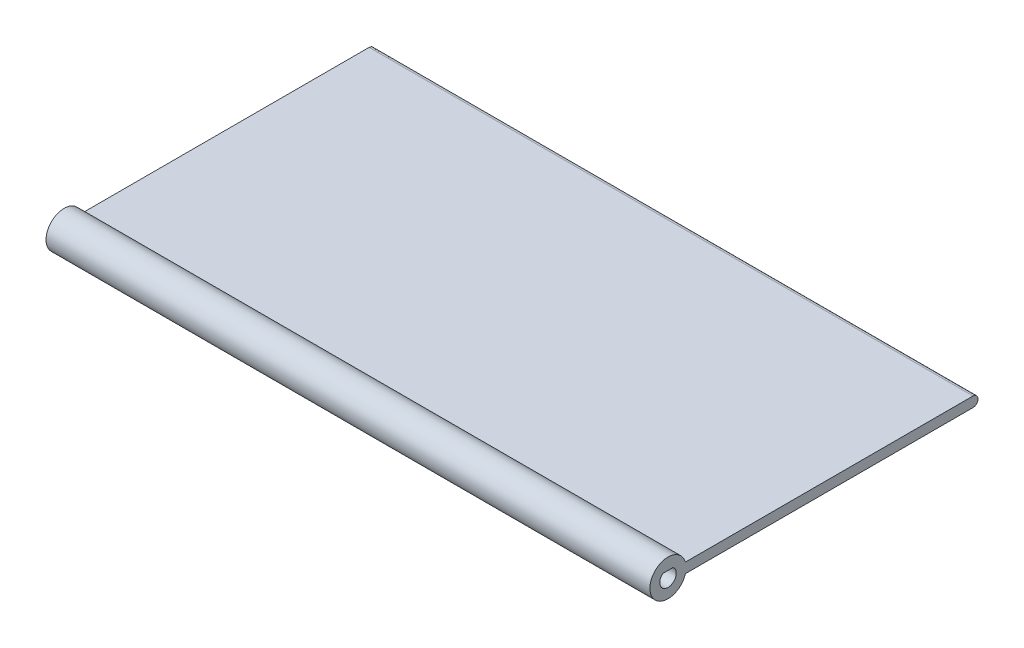
ISO-10303-21;
HEADER;
FILE_DESCRIPTION(('STEP AP214'),'2;1');
FILE_NAME('part.step','',(''),(''),'','','');
FILE_SCHEMA(('AUTOMOTIVE_DESIGN { 1 0 10303 214 1 1 1 1 }'));
ENDSEC;
DATA;
#1=APPLICATION_CONTEXT('core data for automotive mechanical design processes');
#2=APPLICATION_PROTOCOL_DEFINITION('international standard','automotive_design',2000,#1);
#3=PRODUCT_CONTEXT('',#1,'mechanical');
#4=PRODUCT('Part','Part','',(#3));
#5=PRODUCT_RELATED_PRODUCT_CATEGORY('part','',(#4));
#6=PRODUCT_DEFINITION_FORMATION('','',#4);
#7=PRODUCT_DEFINITION_CONTEXT('part definition',#1,'design');
#8=PRODUCT_DEFINITION('design','',#6,#7);
#9=PRODUCT_DEFINITION_SHAPE('','',#8);
#10=(LENGTH_UNIT() NAMED_UNIT(*) SI_UNIT(.MILLI.,.METRE.));
#11=(NAMED_UNIT(*) PLANE_ANGLE_UNIT() SI_UNIT($,.RADIAN.));
#12=(NAMED_UNIT(*) SI_UNIT($,.STERADIAN.) SOLID_ANGLE_UNIT());
#13=UNCERTAINTY_MEASURE_WITH_UNIT(LENGTH_MEASURE(1.E-05),#10,'distance_accuracy_value','');
#14=(GEOMETRIC_REPRESENTATION_CONTEXT(3) GLOBAL_UNCERTAINTY_ASSIGNED_CONTEXT((#13)) GLOBAL_UNIT_ASSIGNED_CONTEXT((#10,
#11,#12)) REPRESENTATION_CONTEXT('',''));
#15=CARTESIAN_POINT('',(0.,0.,0.));
#16=DIRECTION('',(0.,0.,1.));
#17=DIRECTION('',(1.,0.,0.));
#18=AXIS2_PLACEMENT_3D('',#15,#16,#17);
#19=CARTESIAN_POINT('',(300.,0.,0.));
#20=DIRECTION('',(1.,0.,0.));
#21=DIRECTION('',(0.,0.,-1.));
#22=AXIS2_PLACEMENT_3D('',#19,#20,#21);
#23=PLANE('',#22);
#24=DIRECTION('',(0.,0.,1.));
#25=VECTOR('',#24,1.);
#26=CARTESIAN_POINT('',(300.,3.2,2.56320112359526));
#27=LINE('',#26,#25);
#28=CARTESIAN_POINT('',(300.,3.2,-2.56320112359526));
#29=VERTEX_POINT('',#28);
#30=CARTESIAN_POINT('',(300.,3.2,2.56320112359526));
#31=VERTEX_POINT('',#30);
#32=EDGE_CURVE('E162',#29,#31,#27,.T.);
#33=ORIENTED_EDGE('',*,*,#32,.F.);
#34=CARTESIAN_POINT('',(300.,0.,0.));
#35=DIRECTION('',(1.,0.,0.));
#36=DIRECTION('',(0.,0.,-1.));
#37=AXIS2_PLACEMENT_3D('',#34,#35,#36);
#38=CIRCLE('',#37,4.1);
#39=EDGE_CURVE('E143',#31,#29,#38,.T.);
#40=ORIENTED_EDGE('',*,*,#39,.F.);
#41=EDGE_LOOP('',(#33,#40));
#42=FACE_BOUND('',#41,.T.);
#43=CARTESIAN_POINT('',(300.,0.,-151.5));
#44=DIRECTION('',(1.,0.,0.));
#45=DIRECTION('',(0.,0.,-1.));
#46=AXIS2_PLACEMENT_3D('',#43,#44,#45);
#47=CIRCLE('',#46,2.5);
#48=CARTESIAN_POINT('',(300.,-2.5,-151.5));
#49=VERTEX_POINT('',#48);
#50=CARTESIAN_POINT('',(300.,2.5,-151.5));
#51=VERTEX_POINT('',#50);
#52=EDGE_CURVE('E78',#49,#51,#47,.T.);
#53=ORIENTED_EDGE('',*,*,#52,.T.);
#54=DIRECTION('',(0.,0.,1.));
#55=VECTOR('',#54,1.);
#56=CARTESIAN_POINT('',(300.,2.5,-4.1));
#57=LINE('',#56,#55);
#58=CARTESIAN_POINT('',(300.,2.5,-8.64580823289529));
#59=VERTEX_POINT('',#58);
#60=EDGE_CURVE('E202',#51,#59,#57,.T.);
#61=ORIENTED_EDGE('',*,*,#60,.T.);
#62=CARTESIAN_POINT('',(300.,0.,0.));
#63=DIRECTION('',(1.,0.,0.));
#64=DIRECTION('',(0.,0.,-1.));
#65=AXIS2_PLACEMENT_3D('',#62,#63,#64);
#66=CIRCLE('',#65,9.);
#67=CARTESIAN_POINT('',(300.,-2.5,-8.64580823289529));
#68=VERTEX_POINT('',#67);
#69=EDGE_CURVE('E12',#59,#68,#66,.T.);
#70=ORIENTED_EDGE('',*,*,#69,.T.);
#71=DIRECTION('',(0.,0.,-1.));
#72=VECTOR('',#71,1.);
#73=CARTESIAN_POINT('',(300.,-2.5,-4.1));
#74=LINE('',#73,#72);
#75=EDGE_CURVE('E147',#68,#49,#74,.T.);
#76=ORIENTED_EDGE('',*,*,#75,.T.);
#77=EDGE_LOOP('',(#53,#61,#70,#76));
#78=FACE_BOUND('',#77,.T.);
#79=ADVANCED_FACE('F74',(#42,#78),#23,.T.);
#80=CARTESIAN_POINT('',(0.,0.,0.));
#81=DIRECTION('',(1.,0.,0.));
#82=DIRECTION('',(0.,0.,-1.));
#83=AXIS2_PLACEMENT_3D('',#80,#81,#82);
#84=PLANE('',#83);
#85=CARTESIAN_POINT('',(0.,0.,0.));
#86=DIRECTION('',(1.,0.,0.));
#87=DIRECTION('',(0.,0.,-1.));
#88=AXIS2_PLACEMENT_3D('',#85,#86,#87);
#89=CIRCLE('',#88,4.1);
#90=CARTESIAN_POINT('',(0.,3.2,2.56320112359526));
#91=VERTEX_POINT('',#90);
#92=CARTESIAN_POINT('',(0.,3.2,-2.56320112359526));
#93=VERTEX_POINT('',#92);
#94=EDGE_CURVE('E149',#91,#93,#89,.T.);
#95=ORIENTED_EDGE('',*,*,#94,.T.);
#96=DIRECTION('',(0.,0.,1.));
#97=VECTOR('',#96,1.);
#98=CARTESIAN_POINT('',(0.,3.2,2.56320112359526));
#99=LINE('',#98,#97);
#100=EDGE_CURVE('E154',#93,#91,#99,.T.);
#101=ORIENTED_EDGE('',*,*,#100,.T.);
#102=EDGE_LOOP('',(#95,#101));
#103=FACE_BOUND('',#102,.T.);
#104=DIRECTION('',(0.,0.,-1.));
#105=VECTOR('',#104,1.);
#106=CARTESIAN_POINT('',(0.,2.5,-4.1));
#107=LINE('',#106,#105);
#108=CARTESIAN_POINT('',(0.,2.5,-8.64580823289529));
#109=VERTEX_POINT('',#108);
#110=CARTESIAN_POINT('',(0.,2.5,-151.5));
#111=VERTEX_POINT('',#110);
#112=EDGE_CURVE('E138',#109,#111,#107,.T.);
#113=ORIENTED_EDGE('',*,*,#112,.T.);
#114=CARTESIAN_POINT('',(0.,0.,-151.5));
#115=DIRECTION('',(1.,0.,0.));
#116=DIRECTION('',(0.,0.,-1.));
#117=AXIS2_PLACEMENT_3D('',#114,#115,#116);
#118=CIRCLE('',#117,2.5);
#119=CARTESIAN_POINT('',(0.,-2.5,-151.5));
#120=VERTEX_POINT('',#119);
#121=EDGE_CURVE('E114',#120,#111,#118,.T.);
#122=ORIENTED_EDGE('',*,*,#121,.F.);
#123=DIRECTION('',(0.,0.,1.));
#124=VECTOR('',#123,1.);
#125=CARTESIAN_POINT('',(0.,-2.5,-4.1));
#126=LINE('',#125,#124);
#127=CARTESIAN_POINT('',(0.,-2.5,-8.64580823289529));
#128=VERTEX_POINT('',#127);
#129=EDGE_CURVE('E133',#120,#128,#126,.T.);
#130=ORIENTED_EDGE('',*,*,#129,.T.);
#131=CARTESIAN_POINT('',(0.,0.,0.));
#132=DIRECTION('',(1.,0.,0.));
#133=DIRECTION('',(0.,0.,-1.));
#134=AXIS2_PLACEMENT_3D('',#131,#132,#133);
#135=CIRCLE('',#134,9.);
#136=EDGE_CURVE('E84',#109,#128,#135,.T.);
#137=ORIENTED_EDGE('',*,*,#136,.F.);
#138=EDGE_LOOP('',(#113,#122,#130,#137));
#139=FACE_BOUND('',#138,.T.);
#140=ADVANCED_FACE('F135',(#103,#139),#84,.F.);
#141=CARTESIAN_POINT('',(-149.983365744338,-2.5,-4.1));
#142=DIRECTION('',(0.,-1.,0.));
#143=DIRECTION('',(0.,0.,-1.));
#144=AXIS2_PLACEMENT_3D('',#141,#142,#143);
#145=PLANE('',#144);
#146=ORIENTED_EDGE('',*,*,#129,.F.);
#147=DIRECTION('',(1.,0.,0.));
#148=VECTOR('',#147,1.);
#149=CARTESIAN_POINT('',(0.,-2.5,-151.5));
#150=LINE('',#149,#148);
#151=EDGE_CURVE('E195',#120,#49,#150,.T.);
#152=ORIENTED_EDGE('',*,*,#151,.T.);
#153=ORIENTED_EDGE('',*,*,#75,.F.);
#154=DIRECTION('',(-1.,0.,0.));
#155=VECTOR('',#154,1.);
#156=CARTESIAN_POINT('',(300.,-2.5,-8.64580823289529));
#157=LINE('',#156,#155);
#158=EDGE_CURVE('E93',#128,#68,#157,.F.);
#159=ORIENTED_EDGE('',*,*,#158,.F.);
#160=EDGE_LOOP('',(#146,#152,#153,#159));
#161=FACE_BOUND('',#160,.T.);
#162=ADVANCED_FACE('F146',(#161),#145,.T.);
#163=CARTESIAN_POINT('',(300.,0.,0.));
#164=DIRECTION('',(-1.,0.,0.));
#165=DIRECTION('',(0.,0.,1.));
#166=AXIS2_PLACEMENT_3D('',#163,#164,#165);
#167=CYLINDRICAL_SURFACE('',#166,9.);
#168=ORIENTED_EDGE('',*,*,#69,.F.);
#169=DIRECTION('',(-1.,0.,0.));
#170=VECTOR('',#169,1.);
#171=CARTESIAN_POINT('',(300.,2.5,-8.64580823289529));
#172=LINE('',#171,#170);
#173=EDGE_CURVE('E141',#59,#109,#172,.T.);
#174=ORIENTED_EDGE('',*,*,#173,.T.);
#175=ORIENTED_EDGE('',*,*,#136,.T.);
#176=ORIENTED_EDGE('',*,*,#158,.T.);
#177=EDGE_LOOP('',(#168,#174,#175,#176));
#178=FACE_BOUND('',#177,.T.);
#179=ADVANCED_FACE('F76',(#178),#167,.T.);
#180=CARTESIAN_POINT('',(0.,0.,0.));
#181=DIRECTION('',(1.,0.,0.));
#182=DIRECTION('',(0.,0.,-1.));
#183=AXIS2_PLACEMENT_3D('',#180,#181,#182);
#184=CYLINDRICAL_SURFACE('',#183,4.1);
#185=ORIENTED_EDGE('',*,*,#39,.T.);
#186=DIRECTION('',(1.,0.,0.));
#187=VECTOR('',#186,1.);
#188=CARTESIAN_POINT('',(0.,3.2,-2.56320112359526));
#189=LINE('',#188,#187);
#190=EDGE_CURVE('E157',#93,#29,#189,.T.);
#191=ORIENTED_EDGE('',*,*,#190,.F.);
#192=ORIENTED_EDGE('',*,*,#94,.F.);
#193=DIRECTION('',(1.,0.,0.));
#194=VECTOR('',#193,1.);
#195=CARTESIAN_POINT('',(0.,3.2,2.56320112359526));
#196=LINE('',#195,#194);
#197=EDGE_CURVE('E160',#91,#31,#196,.T.);
#198=ORIENTED_EDGE('',*,*,#197,.T.);
#199=EDGE_LOOP('',(#185,#191,#192,#198));
#200=FACE_BOUND('',#199,.T.);
#201=ADVANCED_FACE('F167',(#200),#184,.F.);
#202=CARTESIAN_POINT('',(0.,3.2,2.56320112359526));
#203=DIRECTION('',(0.,1.,0.));
#204=DIRECTION('',(0.,0.,1.));
#205=AXIS2_PLACEMENT_3D('',#202,#203,#204);
#206=PLANE('',#205);
#207=ORIENTED_EDGE('',*,*,#32,.T.);
#208=ORIENTED_EDGE('',*,*,#197,.F.);
#209=ORIENTED_EDGE('',*,*,#100,.F.);
#210=ORIENTED_EDGE('',*,*,#190,.T.);
#211=EDGE_LOOP('',(#207,#208,#209,#210));
#212=FACE_BOUND('',#211,.T.);
#213=ADVANCED_FACE('F173',(#212),#206,.F.);
#214=CARTESIAN_POINT('',(-149.983365744338,2.5,-4.1));
#215=DIRECTION('',(0.,1.,0.));
#216=DIRECTION('',(0.,0.,1.));
#217=AXIS2_PLACEMENT_3D('',#214,#215,#216);
#218=PLANE('',#217);
#219=DIRECTION('',(1.,0.,0.));
#220=VECTOR('',#219,1.);
#221=CARTESIAN_POINT('',(0.,2.5,-151.5));
#222=LINE('',#221,#220);
#223=EDGE_CURVE('E197',#111,#51,#222,.T.);
#224=ORIENTED_EDGE('',*,*,#223,.F.);
#225=ORIENTED_EDGE('',*,*,#112,.F.);
#226=ORIENTED_EDGE('',*,*,#173,.F.);
#227=ORIENTED_EDGE('',*,*,#60,.F.);
#228=EDGE_LOOP('',(#224,#225,#226,#227));
#229=FACE_BOUND('',#228,.T.);
#230=ADVANCED_FACE('F185',(#229),#218,.T.);
#231=CARTESIAN_POINT('',(0.,0.,-151.5));
#232=DIRECTION('',(1.,0.,0.));
#233=DIRECTION('',(0.,0.,-1.));
#234=AXIS2_PLACEMENT_3D('',#231,#232,#233);
#235=CYLINDRICAL_SURFACE('',#234,2.5);
#236=ORIENTED_EDGE('',*,*,#151,.F.);
#237=ORIENTED_EDGE('',*,*,#121,.T.);
#238=ORIENTED_EDGE('',*,*,#223,.T.);
#239=ORIENTED_EDGE('',*,*,#52,.F.);
#240=EDGE_LOOP('',(#236,#237,#238,#239));
#241=FACE_BOUND('',#240,.T.);
#242=ADVANCED_FACE('F190',(#241),#235,.T.);
#243=CLOSED_SHELL('',(#79,#140,#162,#179,#201,#213,#230,#242));
#244=MANIFOLD_SOLID_BREP('B2',#243);
#245=ADVANCED_BREP_SHAPE_REPRESENTATION('',(#18,#244),#14);
#246=SHAPE_DEFINITION_REPRESENTATION(#9,#245);
ENDSEC;
END-ISO-10303-21;
